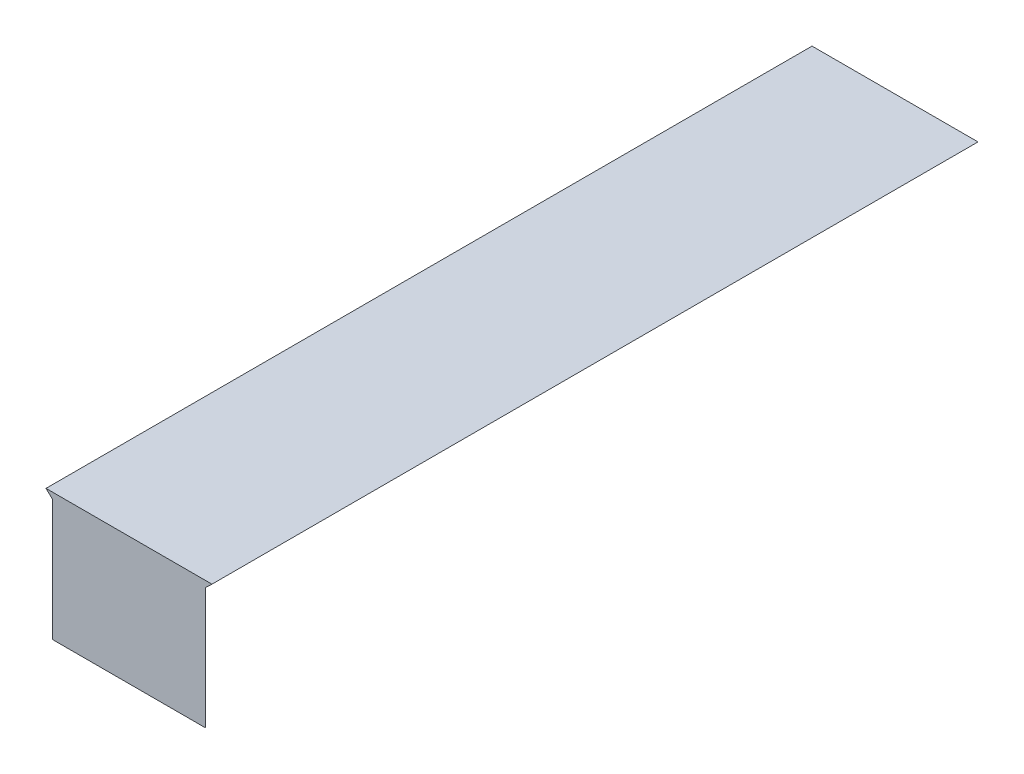
ISO-10303-21;
HEADER;
FILE_DESCRIPTION(('STEP AP214'),'2;1');
FILE_NAME('part.step','',(''),(''),'','','');
FILE_SCHEMA(('AUTOMOTIVE_DESIGN { 1 0 10303 214 1 1 1 1 }'));
ENDSEC;
DATA;
#1=APPLICATION_CONTEXT('core data for automotive mechanical design processes');
#2=APPLICATION_PROTOCOL_DEFINITION('international standard','automotive_design',2000,#1);
#3=PRODUCT_CONTEXT('',#1,'mechanical');
#4=PRODUCT('Part','Part','',(#3));
#5=PRODUCT_RELATED_PRODUCT_CATEGORY('part','',(#4));
#6=PRODUCT_DEFINITION_FORMATION('','',#4);
#7=PRODUCT_DEFINITION_CONTEXT('part definition',#1,'design');
#8=PRODUCT_DEFINITION('design','',#6,#7);
#9=PRODUCT_DEFINITION_SHAPE('','',#8);
#10=(LENGTH_UNIT() NAMED_UNIT(*) SI_UNIT(.MILLI.,.METRE.));
#11=(NAMED_UNIT(*) PLANE_ANGLE_UNIT() SI_UNIT($,.RADIAN.));
#12=(NAMED_UNIT(*) SI_UNIT($,.STERADIAN.) SOLID_ANGLE_UNIT());
#13=UNCERTAINTY_MEASURE_WITH_UNIT(LENGTH_MEASURE(1.E-05),#10,'distance_accuracy_value','');
#14=(GEOMETRIC_REPRESENTATION_CONTEXT(3) GLOBAL_UNCERTAINTY_ASSIGNED_CONTEXT((#13)) GLOBAL_UNIT_ASSIGNED_CONTEXT((#10,
#11,#12)) REPRESENTATION_CONTEXT('',''));
#15=CARTESIAN_POINT('',(0.,0.,0.));
#16=DIRECTION('',(0.,0.,1.));
#17=DIRECTION('',(1.,0.,0.));
#18=AXIS2_PLACEMENT_3D('',#15,#16,#17);
#19=CARTESIAN_POINT('',(-65.,100.,-731.381124976155));
#20=DIRECTION('',(0.,1.,0.));
#21=DIRECTION('',(0.,0.,1.));
#22=AXIS2_PLACEMENT_3D('',#19,#20,#21);
#23=PLANE('',#22);
#24=DIRECTION('',(1.,0.,0.));
#25=VECTOR('',#24,1.);
#26=CARTESIAN_POINT('',(-65.,100.,-600.));
#27=LINE('',#26,#25);
#28=CARTESIAN_POINT('',(-65.,100.,-600.));
#29=VERTEX_POINT('',#28);
#30=CARTESIAN_POINT('',(65.,100.,-600.));
#31=VERTEX_POINT('',#30);
#32=EDGE_CURVE('E131',#29,#31,#27,.T.);
#33=ORIENTED_EDGE('',*,*,#32,.F.);
#34=DIRECTION('',(0.,0.,1.));
#35=VECTOR('',#34,1.);
#36=CARTESIAN_POINT('',(-65.,100.,-731.381124976155));
#37=LINE('',#36,#35);
#38=CARTESIAN_POINT('',(-65.,100.,0.));
#39=VERTEX_POINT('',#38);
#40=EDGE_CURVE('E124',#29,#39,#37,.T.);
#41=ORIENTED_EDGE('',*,*,#40,.T.);
#42=DIRECTION('',(-1.,0.,0.));
#43=VECTOR('',#42,1.);
#44=CARTESIAN_POINT('',(-65.,100.,0.));
#45=LINE('',#44,#43);
#46=CARTESIAN_POINT('',(65.,100.,0.));
#47=VERTEX_POINT('',#46);
#48=EDGE_CURVE('E115',#47,#39,#45,.T.);
#49=ORIENTED_EDGE('',*,*,#48,.F.);
#50=DIRECTION('',(0.,0.,1.));
#51=VECTOR('',#50,1.);
#52=CARTESIAN_POINT('',(65.,100.,-731.381124976155));
#53=LINE('',#52,#51);
#54=EDGE_CURVE('E113',#31,#47,#53,.T.);
#55=ORIENTED_EDGE('',*,*,#54,.F.);
#56=EDGE_LOOP('',(#33,#41,#49,#55));
#57=FACE_BOUND('',#56,.T.);
#58=ADVANCED_FACE('F33',(#57),#23,.T.);
#59=CARTESIAN_POINT('',(59.9999999999999,95.2499999999999,-731.381124976155));
#60=DIRECTION('',(0.688749461914692,-0.724999433594414,0.));
#61=DIRECTION('',(0.724999433594414,0.688749461914692,0.));
#62=AXIS2_PLACEMENT_3D('',#59,#60,#61);
#63=PLANE('',#62);
#64=DIRECTION('',(0.586967270883748,0.55761890733956,0.586967270883752));
#65=VECTOR('',#64,1.);
#66=CARTESIAN_POINT('',(-191.98316105983,-144.134003006838,-251.983161059832));
#67=LINE('',#66,#65);
#68=CARTESIAN_POINT('',(45.,81.,-15.));
#69=VERTEX_POINT('',#68);
#70=CARTESIAN_POINT('',(59.9999999999999,95.2499999999999,0.));
#71=VERTEX_POINT('',#70);
#72=EDGE_CURVE('E87',#69,#71,#67,.T.);
#73=ORIENTED_EDGE('',*,*,#72,.F.);
#74=DIRECTION('',(0.,0.,1.));
#75=VECTOR('',#74,1.);
#76=CARTESIAN_POINT('',(45.,81.,-731.381124976155));
#77=LINE('',#76,#75);
#78=CARTESIAN_POINT('',(45.,81.,-600.));
#79=VERTEX_POINT('',#78);
#80=EDGE_CURVE('E128',#79,#69,#77,.T.);
#81=ORIENTED_EDGE('',*,*,#80,.F.);
#82=DIRECTION('',(-0.724999433594414,-0.688749461914692,0.));
#83=VECTOR('',#82,1.);
#84=CARTESIAN_POINT('',(59.9999999999999,95.2499999999999,-600.));
#85=LINE('',#84,#83);
#86=EDGE_CURVE('E48',#31,#79,#85,.T.);
#87=ORIENTED_EDGE('',*,*,#86,.F.);
#88=ORIENTED_EDGE('',*,*,#54,.T.);
#89=DIRECTION('',(0.724999433594414,0.688749461914693,0.));
#90=VECTOR('',#89,1.);
#91=CARTESIAN_POINT('',(59.9999999999999,95.2499999999999,0.));
#92=LINE('',#91,#90);
#93=EDGE_CURVE('E104',#71,#47,#92,.T.);
#94=ORIENTED_EDGE('',*,*,#93,.F.);
#95=EDGE_LOOP('',(#73,#81,#87,#88,#94));
#96=FACE_BOUND('',#95,.T.);
#97=ADVANCED_FACE('F111',(#96),#63,.T.);
#98=CARTESIAN_POINT('',(45.,81.,-731.381124976155));
#99=DIRECTION('',(0.,-1.,0.));
#100=DIRECTION('',(0.,0.,-1.));
#101=AXIS2_PLACEMENT_3D('',#98,#99,#100);
#102=PLANE('',#101);
#103=DIRECTION('',(1.,0.,0.));
#104=VECTOR('',#103,1.);
#105=CARTESIAN_POINT('',(45.,81.,-15.));
#106=LINE('',#105,#104);
#107=CARTESIAN_POINT('',(-45.,81.,-15.0000000000001));
#108=VERTEX_POINT('',#107);
#109=EDGE_CURVE('E11',#108,#69,#106,.T.);
#110=ORIENTED_EDGE('',*,*,#109,.F.);
#111=DIRECTION('',(0.,0.,1.));
#112=VECTOR('',#111,1.);
#113=CARTESIAN_POINT('',(-45.,81.,-731.381124976155));
#114=LINE('',#113,#112);
#115=CARTESIAN_POINT('',(-45.,81.,-600.));
#116=VERTEX_POINT('',#115);
#117=EDGE_CURVE('E118',#116,#108,#114,.T.);
#118=ORIENTED_EDGE('',*,*,#117,.F.);
#119=DIRECTION('',(-1.,0.,0.));
#120=VECTOR('',#119,1.);
#121=CARTESIAN_POINT('',(45.,81.,-600.));
#122=LINE('',#121,#120);
#123=EDGE_CURVE('E126',#79,#116,#122,.T.);
#124=ORIENTED_EDGE('',*,*,#123,.F.);
#125=ORIENTED_EDGE('',*,*,#80,.T.);
#126=EDGE_LOOP('',(#110,#118,#124,#125));
#127=FACE_BOUND('',#126,.T.);
#128=ADVANCED_FACE('F159',(#127),#102,.T.);
#129=CARTESIAN_POINT('',(-59.9999999999999,95.2499999999999,-731.381124976155));
#130=DIRECTION('',(-0.688749461914693,-0.724999433594414,0.));
#131=DIRECTION('',(0.724999433594414,-0.688749461914693,0.));
#132=AXIS2_PLACEMENT_3D('',#129,#130,#131);
#133=PLANE('',#132);
#134=DIRECTION('',(0.586967270883748,-0.55761890733956,-0.586967270883752));
#135=VECTOR('',#134,1.);
#136=CARTESIAN_POINT('',(191.98316105983,-144.134003006838,-251.983161059832));
#137=LINE('',#136,#135);
#138=CARTESIAN_POINT('',(-59.9999999999999,95.2499999999999,0.));
#139=VERTEX_POINT('',#138);
#140=EDGE_CURVE('E98',#139,#108,#137,.T.);
#141=ORIENTED_EDGE('',*,*,#140,.F.);
#142=DIRECTION('',(0.724999433594414,-0.688749461914693,0.));
#143=VECTOR('',#142,1.);
#144=CARTESIAN_POINT('',(-59.9999999999999,95.2499999999999,0.));
#145=LINE('',#144,#143);
#146=EDGE_CURVE('E116',#39,#139,#145,.T.);
#147=ORIENTED_EDGE('',*,*,#146,.F.);
#148=ORIENTED_EDGE('',*,*,#40,.F.);
#149=DIRECTION('',(-0.724999433594414,0.688749461914693,0.));
#150=VECTOR('',#149,1.);
#151=CARTESIAN_POINT('',(-59.9999999999999,95.2499999999999,-600.));
#152=LINE('',#151,#150);
#153=EDGE_CURVE('E42',#116,#29,#152,.T.);
#154=ORIENTED_EDGE('',*,*,#153,.F.);
#155=ORIENTED_EDGE('',*,*,#117,.T.);
#156=EDGE_LOOP('',(#141,#147,#148,#154,#155));
#157=FACE_BOUND('',#156,.T.);
#158=ADVANCED_FACE('F35',(#157),#133,.T.);
#159=CARTESIAN_POINT('',(0.,0.,0.));
#160=DIRECTION('',(0.,0.,1.));
#161=DIRECTION('',(1.,0.,0.));
#162=AXIS2_PLACEMENT_3D('',#159,#160,#161);
#163=PLANE('',#162);
#164=DIRECTION('',(0.,-1.,0.));
#165=VECTOR('',#164,1.);
#166=CARTESIAN_POINT('',(59.9999999999999,95.2499999999999,0.));
#167=LINE('',#166,#165);
#168=CARTESIAN_POINT('',(59.9999999999999,0.,0.));
#169=VERTEX_POINT('',#168);
#170=EDGE_CURVE('E91',#71,#169,#167,.T.);
#171=ORIENTED_EDGE('',*,*,#170,.F.);
#172=ORIENTED_EDGE('',*,*,#93,.T.);
#173=ORIENTED_EDGE('',*,*,#48,.T.);
#174=ORIENTED_EDGE('',*,*,#146,.T.);
#175=DIRECTION('',(0.,-1.,0.));
#176=VECTOR('',#175,1.);
#177=CARTESIAN_POINT('',(-59.9999999999999,95.2499999999999,0.));
#178=LINE('',#177,#176);
#179=CARTESIAN_POINT('',(-59.9999999999999,0.,0.));
#180=VERTEX_POINT('',#179);
#181=EDGE_CURVE('E109',#139,#180,#178,.T.);
#182=ORIENTED_EDGE('',*,*,#181,.T.);
#183=DIRECTION('',(-1.,0.,0.));
#184=VECTOR('',#183,1.);
#185=CARTESIAN_POINT('',(59.9999999999999,0.,0.));
#186=LINE('',#185,#184);
#187=EDGE_CURVE('E107',#169,#180,#186,.T.);
#188=ORIENTED_EDGE('',*,*,#187,.F.);
#189=EDGE_LOOP('',(#171,#172,#173,#174,#182,#188));
#190=FACE_BOUND('',#189,.T.);
#191=ADVANCED_FACE('F102',(#190),#163,.T.);
#192=CARTESIAN_POINT('',(-300.,100.,-600.));
#193=DIRECTION('',(0.,0.,1.));
#194=DIRECTION('',(1.,0.,0.));
#195=AXIS2_PLACEMENT_3D('',#192,#193,#194);
#196=PLANE('',#195);
#197=ORIENTED_EDGE('',*,*,#32,.T.);
#198=ORIENTED_EDGE('',*,*,#86,.T.);
#199=ORIENTED_EDGE('',*,*,#123,.T.);
#200=ORIENTED_EDGE('',*,*,#153,.T.);
#201=EDGE_LOOP('',(#197,#198,#199,#200));
#202=FACE_BOUND('',#201,.T.);
#203=ADVANCED_FACE('F174',(#202),#196,.F.);
#204=CARTESIAN_POINT('',(45.,95.2499999999999,-15.));
#205=DIRECTION('',(0.,0.,-1.));
#206=DIRECTION('',(-1.,0.,0.));
#207=AXIS2_PLACEMENT_3D('',#204,#205,#206);
#208=PLANE('',#207);
#209=DIRECTION('',(0.,-1.,0.));
#210=VECTOR('',#209,1.);
#211=CARTESIAN_POINT('',(-45.,95.2499999999999,-15.));
#212=LINE('',#211,#210);
#213=CARTESIAN_POINT('',(-45.,0.,-15.));
#214=VERTEX_POINT('',#213);
#215=EDGE_CURVE('E99',#108,#214,#212,.T.);
#216=ORIENTED_EDGE('',*,*,#215,.F.);
#217=ORIENTED_EDGE('',*,*,#109,.T.);
#218=DIRECTION('',(0.,-1.,0.));
#219=VECTOR('',#218,1.);
#220=CARTESIAN_POINT('',(45.,95.2499999999999,-15.));
#221=LINE('',#220,#219);
#222=CARTESIAN_POINT('',(45.,0.,-15.));
#223=VERTEX_POINT('',#222);
#224=EDGE_CURVE('E93',#69,#223,#221,.T.);
#225=ORIENTED_EDGE('',*,*,#224,.T.);
#226=DIRECTION('',(1.,0.,0.));
#227=VECTOR('',#226,1.);
#228=CARTESIAN_POINT('',(45.,0.,-15.));
#229=LINE('',#228,#227);
#230=EDGE_CURVE('E147',#214,#223,#229,.T.);
#231=ORIENTED_EDGE('',*,*,#230,.F.);
#232=EDGE_LOOP('',(#216,#217,#225,#231));
#233=FACE_BOUND('',#232,.T.);
#234=ADVANCED_FACE('F155',(#233),#208,.T.);
#235=CARTESIAN_POINT('',(-45.,95.2499999999999,-15.));
#236=DIRECTION('',(-0.70710678118655,0.,-0.707106781186545));
#237=DIRECTION('',(-0.707106781186545,0.,0.70710678118655));
#238=AXIS2_PLACEMENT_3D('',#235,#236,#237);
#239=PLANE('',#238);
#240=ORIENTED_EDGE('',*,*,#181,.F.);
#241=ORIENTED_EDGE('',*,*,#140,.T.);
#242=ORIENTED_EDGE('',*,*,#215,.T.);
#243=DIRECTION('',(0.707106781186545,0.,-0.70710678118655));
#244=VECTOR('',#243,1.);
#245=CARTESIAN_POINT('',(-45.,0.,-15.));
#246=LINE('',#245,#244);
#247=EDGE_CURVE('E138',#180,#214,#246,.T.);
#248=ORIENTED_EDGE('',*,*,#247,.F.);
#249=EDGE_LOOP('',(#240,#241,#242,#248));
#250=FACE_BOUND('',#249,.T.);
#251=ADVANCED_FACE('F166',(#250),#239,.T.);
#252=CARTESIAN_POINT('',(59.9999999999999,95.2499999999999,0.));
#253=DIRECTION('',(0.70710678118655,0.,-0.707106781186545));
#254=DIRECTION('',(-0.707106781186545,0.,-0.70710678118655));
#255=AXIS2_PLACEMENT_3D('',#252,#253,#254);
#256=PLANE('',#255);
#257=ORIENTED_EDGE('',*,*,#224,.F.);
#258=ORIENTED_EDGE('',*,*,#72,.T.);
#259=ORIENTED_EDGE('',*,*,#170,.T.);
#260=DIRECTION('',(0.707106781186545,0.,0.70710678118655));
#261=VECTOR('',#260,1.);
#262=CARTESIAN_POINT('',(59.9999999999999,0.,0.));
#263=LINE('',#262,#261);
#264=EDGE_CURVE('E145',#223,#169,#263,.T.);
#265=ORIENTED_EDGE('',*,*,#264,.F.);
#266=EDGE_LOOP('',(#257,#258,#259,#265));
#267=FACE_BOUND('',#266,.T.);
#268=ADVANCED_FACE('F89',(#267),#256,.T.);
#269=CARTESIAN_POINT('',(0.,0.,0.));
#270=DIRECTION('',(0.,1.,0.));
#271=DIRECTION('',(0.,0.,1.));
#272=AXIS2_PLACEMENT_3D('',#269,#270,#271);
#273=PLANE('',#272);
#274=ORIENTED_EDGE('',*,*,#230,.T.);
#275=ORIENTED_EDGE('',*,*,#264,.T.);
#276=ORIENTED_EDGE('',*,*,#187,.T.);
#277=ORIENTED_EDGE('',*,*,#247,.T.);
#278=EDGE_LOOP('',(#274,#275,#276,#277));
#279=FACE_BOUND('',#278,.T.);
#280=ADVANCED_FACE('F151',(#279),#273,.F.);
#281=CLOSED_SHELL('',(#58,#97,#128,#158,#191,#203,#234,#251,#268,#280));
#282=MANIFOLD_SOLID_BREP('B2',#281);
#283=ADVANCED_BREP_SHAPE_REPRESENTATION('',(#18,#282),#14);
#284=SHAPE_DEFINITION_REPRESENTATION(#9,#283);
ENDSEC;
END-ISO-10303-21;
